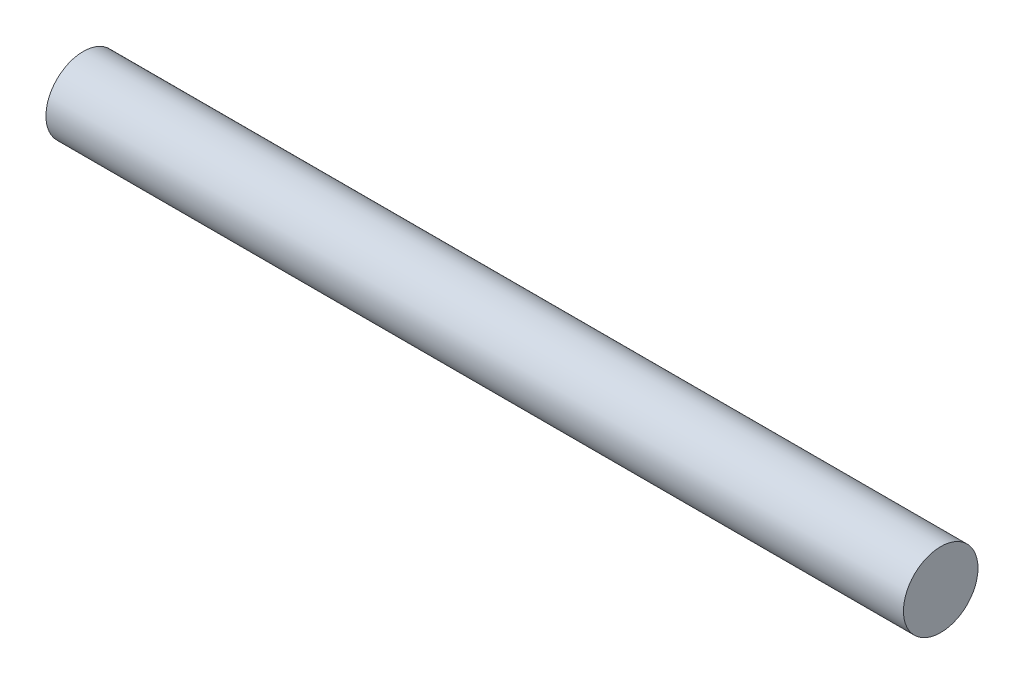
ISO-10303-21;
HEADER;
FILE_DESCRIPTION(('STEP AP214'),'2;1');
FILE_NAME('part.step','',(''),(''),'','','');
FILE_SCHEMA(('AUTOMOTIVE_DESIGN { 1 0 10303 214 1 1 1 1 }'));
ENDSEC;
DATA;
#1=APPLICATION_CONTEXT('core data for automotive mechanical design processes');
#2=APPLICATION_PROTOCOL_DEFINITION('international standard','automotive_design',2000,#1);
#3=PRODUCT_CONTEXT('',#1,'mechanical');
#4=PRODUCT('Part','Part','',(#3));
#5=PRODUCT_RELATED_PRODUCT_CATEGORY('part','',(#4));
#6=PRODUCT_DEFINITION_FORMATION('','',#4);
#7=PRODUCT_DEFINITION_CONTEXT('part definition',#1,'design');
#8=PRODUCT_DEFINITION('design','',#6,#7);
#9=PRODUCT_DEFINITION_SHAPE('','',#8);
#10=(LENGTH_UNIT() NAMED_UNIT(*) SI_UNIT(.MILLI.,.METRE.));
#11=(NAMED_UNIT(*) PLANE_ANGLE_UNIT() SI_UNIT($,.RADIAN.));
#12=(NAMED_UNIT(*) SI_UNIT($,.STERADIAN.) SOLID_ANGLE_UNIT());
#13=UNCERTAINTY_MEASURE_WITH_UNIT(LENGTH_MEASURE(1.E-05),#10,'distance_accuracy_value','');
#14=(GEOMETRIC_REPRESENTATION_CONTEXT(3) GLOBAL_UNCERTAINTY_ASSIGNED_CONTEXT((#13)) GLOBAL_UNIT_ASSIGNED_CONTEXT((#10,
#11,#12)) REPRESENTATION_CONTEXT('',''));
#15=CARTESIAN_POINT('',(0.,0.,0.));
#16=DIRECTION('',(0.,0.,1.));
#17=DIRECTION('',(1.,0.,0.));
#18=AXIS2_PLACEMENT_3D('',#15,#16,#17);
#19=CARTESIAN_POINT('',(34.5,0.,0.));
#20=DIRECTION('',(-1.,0.,0.));
#21=DIRECTION('',(0.,0.,1.));
#22=AXIS2_PLACEMENT_3D('',#19,#20,#21);
#23=CYLINDRICAL_SURFACE('',#22,1.5);
#24=CARTESIAN_POINT('',(34.5,0.,0.));
#25=DIRECTION('',(1.,0.,0.));
#26=DIRECTION('',(0.,0.,-1.));
#27=AXIS2_PLACEMENT_3D('',#24,#25,#26);
#28=CIRCLE('',#27,1.5);
#29=CARTESIAN_POINT('',(34.5,0.,-1.5));
#30=VERTEX_POINT('',#29);
#31=EDGE_CURVE('E10',#30,#30,#28,.T.);
#32=ORIENTED_EDGE('',*,*,#31,.F.);
#33=EDGE_LOOP('',(#32));
#34=FACE_BOUND('',#33,.T.);
#35=CARTESIAN_POINT('',(0.,0.,0.));
#36=DIRECTION('',(1.,0.,0.));
#37=DIRECTION('',(0.,0.,-1.));
#38=AXIS2_PLACEMENT_3D('',#35,#36,#37);
#39=CIRCLE('',#38,1.5);
#40=CARTESIAN_POINT('',(0.,0.,-1.5));
#41=VERTEX_POINT('',#40);
#42=EDGE_CURVE('E34',#41,#41,#39,.T.);
#43=ORIENTED_EDGE('',*,*,#42,.T.);
#44=EDGE_LOOP('',(#43));
#45=FACE_BOUND('',#44,.T.);
#46=ADVANCED_FACE('F31',(#34,#45),#23,.T.);
#47=CARTESIAN_POINT('',(34.5,0.,0.));
#48=DIRECTION('',(1.,0.,0.));
#49=DIRECTION('',(0.,0.,-1.));
#50=AXIS2_PLACEMENT_3D('',#47,#48,#49);
#51=PLANE('',#50);
#52=ORIENTED_EDGE('',*,*,#31,.T.);
#53=EDGE_LOOP('',(#52));
#54=FACE_BOUND('',#53,.T.);
#55=ADVANCED_FACE('F46',(#54),#51,.T.);
#56=CARTESIAN_POINT('',(0.,0.,0.));
#57=DIRECTION('',(1.,0.,0.));
#58=DIRECTION('',(0.,0.,-1.));
#59=AXIS2_PLACEMENT_3D('',#56,#57,#58);
#60=PLANE('',#59);
#61=ORIENTED_EDGE('',*,*,#42,.F.);
#62=EDGE_LOOP('',(#61));
#63=FACE_BOUND('',#62,.T.);
#64=ADVANCED_FACE('F44',(#63),#60,.F.);
#65=CLOSED_SHELL('',(#46,#55,#64));
#66=MANIFOLD_SOLID_BREP('B2',#65);
#67=ADVANCED_BREP_SHAPE_REPRESENTATION('',(#18,#66),#14);
#68=SHAPE_DEFINITION_REPRESENTATION(#9,#67);
ENDSEC;
END-ISO-10303-21;
